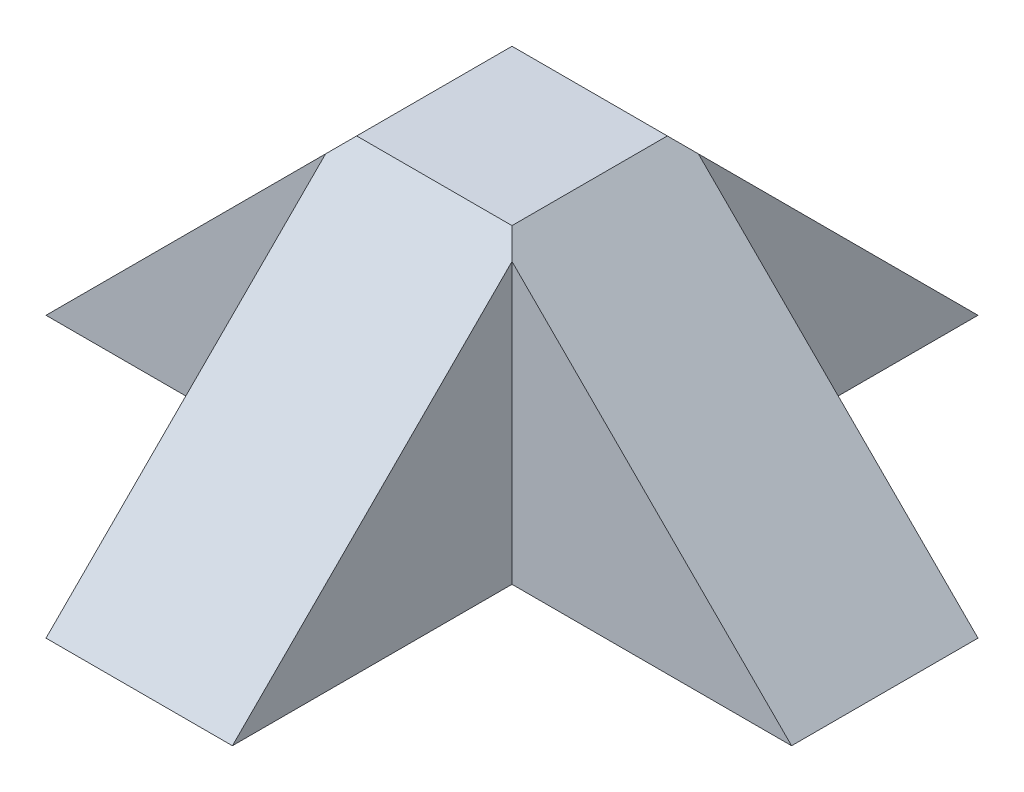
ISO-10303-21;
HEADER;
FILE_DESCRIPTION(('STEP AP214'),'2;1');
FILE_NAME('part.step','',(''),(''),'','','');
FILE_SCHEMA(('AUTOMOTIVE_DESIGN { 1 0 10303 214 1 1 1 1 }'));
ENDSEC;
DATA;
#1=APPLICATION_CONTEXT('core data for automotive mechanical design processes');
#2=APPLICATION_PROTOCOL_DEFINITION('international standard','automotive_design',2000,#1);
#3=PRODUCT_CONTEXT('',#1,'mechanical');
#4=PRODUCT('Part','Part','',(#3));
#5=PRODUCT_RELATED_PRODUCT_CATEGORY('part','',(#4));
#6=PRODUCT_DEFINITION_FORMATION('','',#4);
#7=PRODUCT_DEFINITION_CONTEXT('part definition',#1,'design');
#8=PRODUCT_DEFINITION('design','',#6,#7);
#9=PRODUCT_DEFINITION_SHAPE('','',#8);
#10=(LENGTH_UNIT() NAMED_UNIT(*) SI_UNIT(.MILLI.,.METRE.));
#11=(NAMED_UNIT(*) PLANE_ANGLE_UNIT() SI_UNIT($,.RADIAN.));
#12=(NAMED_UNIT(*) SI_UNIT($,.STERADIAN.) SOLID_ANGLE_UNIT());
#13=UNCERTAINTY_MEASURE_WITH_UNIT(LENGTH_MEASURE(1.E-05),#10,'distance_accuracy_value','');
#14=(GEOMETRIC_REPRESENTATION_CONTEXT(3) GLOBAL_UNCERTAINTY_ASSIGNED_CONTEXT((#13)) GLOBAL_UNIT_ASSIGNED_CONTEXT((#10,
#11,#12)) REPRESENTATION_CONTEXT('',''));
#15=CARTESIAN_POINT('',(0.,0.,0.));
#16=DIRECTION('',(0.,0.,1.));
#17=DIRECTION('',(1.,0.,0.));
#18=AXIS2_PLACEMENT_3D('',#15,#16,#17);
#19=CARTESIAN_POINT('',(10.2999999999994,-4.15000000000118,19.5555136271292));
#20=DIRECTION('',(0.,1.,0.));
#21=DIRECTION('',(0.,0.,1.));
#22=AXIS2_PLACEMENT_3D('',#19,#20,#21);
#23=PLANE('',#22);
#24=DIRECTION('',(0.,0.,1.));
#25=VECTOR('',#24,1.);
#26=CARTESIAN_POINT('',(10.550000000001,-4.15000000000118,19.5555136271292));
#27=LINE('',#26,#25);
#28=CARTESIAN_POINT('',(10.550000000001,-4.15000000000054,19.3055136271296));
#29=VERTEX_POINT('',#28);
#30=CARTESIAN_POINT('',(10.550000000001,-4.15000000000118,19.8055136271308));
#31=VERTEX_POINT('',#30);
#32=EDGE_CURVE('E147',#29,#31,#27,.T.);
#33=ORIENTED_EDGE('',*,*,#32,.F.);
#34=DIRECTION('',(1.,0.,0.));
#35=VECTOR('',#34,1.);
#36=CARTESIAN_POINT('',(10.2999999999994,-4.14999999999991,19.3055136271289));
#37=LINE('',#36,#35);
#38=CARTESIAN_POINT('',(10.0500000000001,-4.15000000000023,19.3055136271296));
#39=VERTEX_POINT('',#38);
#40=EDGE_CURVE('E21',#39,#29,#37,.T.);
#41=ORIENTED_EDGE('',*,*,#40,.F.);
#42=DIRECTION('',(0.,0.,1.));
#43=VECTOR('',#42,1.);
#44=CARTESIAN_POINT('',(10.0499999999992,-4.14999999999991,19.5555136271292));
#45=LINE('',#44,#43);
#46=CARTESIAN_POINT('',(10.0500000000001,-4.15000000000086,19.8055136271308));
#47=VERTEX_POINT('',#46);
#48=EDGE_CURVE('E121',#39,#47,#45,.T.);
#49=ORIENTED_EDGE('',*,*,#48,.T.);
#50=DIRECTION('',(1.,0.,0.));
#51=VECTOR('',#50,1.);
#52=CARTESIAN_POINT('',(10.2999999999994,-4.15000000000118,19.8055136271308));
#53=LINE('',#52,#51);
#54=EDGE_CURVE('E133',#31,#47,#53,.F.);
#55=ORIENTED_EDGE('',*,*,#54,.F.);
#56=EDGE_LOOP('',(#33,#41,#49,#55));
#57=FACE_BOUND('',#56,.T.);
#58=ADVANCED_FACE('F18',(#57),#23,.T.);
#59=CARTESIAN_POINT('',(10.2999999999994,-4.62499999999928,18.8305136271296));
#60=DIRECTION('',(0.,0.707106781186548,-0.707106781186548));
#61=DIRECTION('',(0.,0.707106781186548,0.707106781186548));
#62=AXIS2_PLACEMENT_3D('',#59,#60,#61);
#63=PLANE('',#62);
#64=DIRECTION('',(1.,0.,0.));
#65=VECTOR('',#64,1.);
#66=CARTESIAN_POINT('',(10.2999999999994,-5.09999999999992,18.3555136271289));
#67=LINE('',#66,#65);
#68=CARTESIAN_POINT('',(10.6000000000008,-5.09999999999992,18.3555136271289));
#69=VERTEX_POINT('',#68);
#70=CARTESIAN_POINT('',(10.0000000000006,-5.09999999999992,18.3555136271289));
#71=VERTEX_POINT('',#70);
#72=EDGE_CURVE('E103',#69,#71,#67,.F.);
#73=ORIENTED_EDGE('',*,*,#72,.T.);
#74=DIRECTION('',(0.,0.70710678118555,0.707106781187545));
#75=VECTOR('',#74,1.);
#76=CARTESIAN_POINT('',(10.0000000000006,-5.09999999999992,18.3555136271289));
#77=LINE('',#76,#75);
#78=CARTESIAN_POINT('',(10.0000000000005,-4.20000000000066,19.2555136271303));
#79=VERTEX_POINT('',#78);
#80=EDGE_CURVE('E97',#71,#79,#77,.T.);
#81=ORIENTED_EDGE('',*,*,#80,.T.);
#82=DIRECTION('',(0.577350269189626,0.577350269189626,0.577350269189626));
#83=VECTOR('',#82,1.);
#84=CARTESIAN_POINT('',(9.99999999999937,-4.19999999999971,19.2555136271304));
#85=LINE('',#84,#83);
#86=EDGE_CURVE('E101',#79,#39,#85,.T.);
#87=ORIENTED_EDGE('',*,*,#86,.T.);
#88=ORIENTED_EDGE('',*,*,#40,.T.);
#89=DIRECTION('',(-0.577350269189636,0.577350269189626,0.577350269189616));
#90=VECTOR('',#89,1.);
#91=CARTESIAN_POINT('',(10.6000000000008,-4.20000000000098,19.2555136271304));
#92=LINE('',#91,#90);
#93=CARTESIAN_POINT('',(10.6000000000008,-4.20000000000082,19.2555136271303));
#94=VERTEX_POINT('',#93);
#95=EDGE_CURVE('E144',#94,#29,#92,.T.);
#96=ORIENTED_EDGE('',*,*,#95,.F.);
#97=DIRECTION('',(0.,0.70710678118555,0.707106781187545));
#98=VECTOR('',#97,1.);
#99=CARTESIAN_POINT('',(10.6000000000008,-5.09999999999992,18.3555136271289));
#100=LINE('',#99,#98);
#101=EDGE_CURVE('E158',#69,#94,#100,.T.);
#102=ORIENTED_EDGE('',*,*,#101,.F.);
#103=EDGE_LOOP('',(#73,#81,#87,#88,#96,#102));
#104=FACE_BOUND('',#103,.T.);
#105=ADVANCED_FACE('F99',(#104),#63,.T.);
#106=CARTESIAN_POINT('',(10.0000000000006,-4.64999999999918,18.8055136271297));
#107=DIRECTION('',(1.,0.,0.));
#108=DIRECTION('',(0.,0.,-1.));
#109=AXIS2_PLACEMENT_3D('',#106,#107,#108);
#110=PLANE('',#109);
#111=DIRECTION('',(0.,1.,0.));
#112=VECTOR('',#111,1.);
#113=CARTESIAN_POINT('',(10.0000000000006,-4.64999999999918,19.2555136271304));
#114=LINE('',#113,#112);
#115=CARTESIAN_POINT('',(10.0000000000006,-5.09999999999992,19.2555136271304));
#116=VERTEX_POINT('',#115);
#117=EDGE_CURVE('E107',#116,#79,#114,.T.);
#118=ORIENTED_EDGE('',*,*,#117,.T.);
#119=ORIENTED_EDGE('',*,*,#80,.F.);
#120=DIRECTION('',(0.,0.,1.));
#121=VECTOR('',#120,1.);
#122=CARTESIAN_POINT('',(10.0000000000006,-5.09999999999992,19.5555136271292));
#123=LINE('',#122,#121);
#124=EDGE_CURVE('E109',#71,#116,#123,.T.);
#125=ORIENTED_EDGE('',*,*,#124,.T.);
#126=EDGE_LOOP('',(#118,#119,#125));
#127=FACE_BOUND('',#126,.T.);
#128=ADVANCED_FACE('F108',(#127),#110,.F.);
#129=CARTESIAN_POINT('',(9.5499999999999,-4.64999999999918,19.2555136271304));
#130=DIRECTION('',(0.,0.,1.));
#131=DIRECTION('',(1.,0.,0.));
#132=AXIS2_PLACEMENT_3D('',#129,#130,#131);
#133=PLANE('',#132);
#134=DIRECTION('',(1.,0.,0.));
#135=VECTOR('',#134,1.);
#136=CARTESIAN_POINT('',(10.2999999999994,-5.09999999999992,19.2555136271304));
#137=LINE('',#136,#135);
#138=CARTESIAN_POINT('',(9.09999999999916,-5.09999999999992,19.2555136271304));
#139=VERTEX_POINT('',#138);
#140=EDGE_CURVE('E124',#116,#139,#137,.F.);
#141=ORIENTED_EDGE('',*,*,#140,.T.);
#142=DIRECTION('',(0.707106781186548,0.707106781186548,0.));
#143=VECTOR('',#142,1.);
#144=CARTESIAN_POINT('',(9.5749999999998,-4.62499999999928,19.2555136271304));
#145=LINE('',#144,#143);
#146=EDGE_CURVE('E114',#139,#79,#145,.T.);
#147=ORIENTED_EDGE('',*,*,#146,.T.);
#148=ORIENTED_EDGE('',*,*,#117,.F.);
#149=EDGE_LOOP('',(#141,#147,#148));
#150=FACE_BOUND('',#149,.T.);
#151=ADVANCED_FACE('F123',(#150),#133,.F.);
#152=CARTESIAN_POINT('',(9.5749999999998,-4.62499999999928,19.5555136271292));
#153=DIRECTION('',(0.707106781186548,-0.707106781186548,0.));
#154=DIRECTION('',(0.707106781186548,0.707106781186548,0.));
#155=AXIS2_PLACEMENT_3D('',#152,#153,#154);
#156=PLANE('',#155);
#157=ORIENTED_EDGE('',*,*,#48,.F.);
#158=ORIENTED_EDGE('',*,*,#86,.F.);
#159=ORIENTED_EDGE('',*,*,#146,.F.);
#160=DIRECTION('',(0.,0.,1.));
#161=VECTOR('',#160,1.);
#162=CARTESIAN_POINT('',(9.09999999999916,-5.09999999999992,19.5555136271292));
#163=LINE('',#162,#161);
#164=CARTESIAN_POINT('',(9.09999999999916,-5.09999999999992,19.8555136271306));
#165=VERTEX_POINT('',#164);
#166=EDGE_CURVE('E163',#139,#165,#163,.T.);
#167=ORIENTED_EDGE('',*,*,#166,.T.);
#168=DIRECTION('',(-0.707106781187545,-0.70710678118555,0.));
#169=VECTOR('',#168,1.);
#170=CARTESIAN_POINT('',(10.0000000000006,-4.20000000000098,19.8555136271306));
#171=LINE('',#170,#169);
#172=CARTESIAN_POINT('',(10.0000000000003,-4.20000000000066,19.8555136271306));
#173=VERTEX_POINT('',#172);
#174=EDGE_CURVE('E128',#173,#165,#171,.T.);
#175=ORIENTED_EDGE('',*,*,#174,.F.);
#176=DIRECTION('',(-0.577350269189602,-0.577350269189633,0.577350269189642));
#177=VECTOR('',#176,1.);
#178=CARTESIAN_POINT('',(10.0500000000004,-4.15000000000118,19.8055136271308));
#179=LINE('',#178,#177);
#180=EDGE_CURVE('E135',#47,#173,#179,.T.);
#181=ORIENTED_EDGE('',*,*,#180,.F.);
#182=EDGE_LOOP('',(#157,#158,#159,#167,#175,#181));
#183=FACE_BOUND('',#182,.T.);
#184=ADVANCED_FACE('F117',(#183),#156,.F.);
#185=CARTESIAN_POINT('',(9.5499999999999,-4.64999999999918,19.8555136271306));
#186=DIRECTION('',(0.,0.,1.));
#187=DIRECTION('',(1.,0.,0.));
#188=AXIS2_PLACEMENT_3D('',#185,#186,#187);
#189=PLANE('',#188);
#190=DIRECTION('',(0.,1.,0.));
#191=VECTOR('',#190,1.);
#192=CARTESIAN_POINT('',(10.0000000000006,-4.64999999999918,19.8555136271306));
#193=LINE('',#192,#191);
#194=CARTESIAN_POINT('',(10.0000000000006,-5.09999999999992,19.8555136271306));
#195=VERTEX_POINT('',#194);
#196=EDGE_CURVE('E130',#195,#173,#193,.T.);
#197=ORIENTED_EDGE('',*,*,#196,.T.);
#198=ORIENTED_EDGE('',*,*,#174,.T.);
#199=DIRECTION('',(1.,0.,0.));
#200=VECTOR('',#199,1.);
#201=CARTESIAN_POINT('',(10.2999999999994,-5.09999999999992,19.8555136271306));
#202=LINE('',#201,#200);
#203=EDGE_CURVE('E165',#165,#195,#202,.T.);
#204=ORIENTED_EDGE('',*,*,#203,.T.);
#205=EDGE_LOOP('',(#197,#198,#204));
#206=FACE_BOUND('',#205,.T.);
#207=ADVANCED_FACE('F210',(#206),#189,.T.);
#208=CARTESIAN_POINT('',(10.0000000000006,-4.64999999999918,20.3055136271288));
#209=DIRECTION('',(1.,0.,0.));
#210=DIRECTION('',(0.,0.,-1.));
#211=AXIS2_PLACEMENT_3D('',#208,#209,#210);
#212=PLANE('',#211);
#213=DIRECTION('',(0.,0.,1.));
#214=VECTOR('',#213,1.);
#215=CARTESIAN_POINT('',(10.0000000000006,-5.09999999999992,19.5555136271292));
#216=LINE('',#215,#214);
#217=CARTESIAN_POINT('',(10.0000000000006,-5.09999999999992,20.7555136271295));
#218=VERTEX_POINT('',#217);
#219=EDGE_CURVE('E168',#195,#218,#216,.T.);
#220=ORIENTED_EDGE('',*,*,#219,.T.);
#221=DIRECTION('',(0.,-0.707106781186548,0.707106781186548));
#222=VECTOR('',#221,1.);
#223=CARTESIAN_POINT('',(10.0000000000006,-4.62499999999928,20.2805136271289));
#224=LINE('',#223,#222);
#225=EDGE_CURVE('E138',#173,#218,#224,.T.);
#226=ORIENTED_EDGE('',*,*,#225,.F.);
#227=ORIENTED_EDGE('',*,*,#196,.F.);
#228=EDGE_LOOP('',(#220,#226,#227));
#229=FACE_BOUND('',#228,.T.);
#230=ADVANCED_FACE('F208',(#229),#212,.F.);
#231=CARTESIAN_POINT('',(10.2999999999994,-4.62499999999928,20.2805136271289));
#232=DIRECTION('',(0.,0.707106781186548,0.707106781186548));
#233=DIRECTION('',(0.,-0.707106781186548,0.707106781186548));
#234=AXIS2_PLACEMENT_3D('',#231,#232,#233);
#235=PLANE('',#234);
#236=DIRECTION('',(1.,0.,0.));
#237=VECTOR('',#236,1.);
#238=CARTESIAN_POINT('',(10.2999999999994,-5.09999999999992,20.7555136271295));
#239=LINE('',#238,#237);
#240=CARTESIAN_POINT('',(10.6000000000008,-5.09999999999992,20.7555136271295));
#241=VERTEX_POINT('',#240);
#242=EDGE_CURVE('E171',#218,#241,#239,.T.);
#243=ORIENTED_EDGE('',*,*,#242,.T.);
#244=DIRECTION('',(0.,-0.707106781186549,0.707106781186546));
#245=VECTOR('',#244,1.);
#246=CARTESIAN_POINT('',(10.6000000000008,-4.20000000000098,19.8555136271306));
#247=LINE('',#246,#245);
#248=CARTESIAN_POINT('',(10.6000000000008,-4.20000000000098,19.8555136271306));
#249=VERTEX_POINT('',#248);
#250=EDGE_CURVE('E140',#249,#241,#247,.T.);
#251=ORIENTED_EDGE('',*,*,#250,.F.);
#252=DIRECTION('',(0.577350269189623,-0.577350269189613,0.577350269189642));
#253=VECTOR('',#252,1.);
#254=CARTESIAN_POINT('',(10.550000000001,-4.15000000000118,19.8055136271308));
#255=LINE('',#254,#253);
#256=EDGE_CURVE('E149',#31,#249,#255,.T.);
#257=ORIENTED_EDGE('',*,*,#256,.F.);
#258=ORIENTED_EDGE('',*,*,#54,.T.);
#259=ORIENTED_EDGE('',*,*,#180,.T.);
#260=ORIENTED_EDGE('',*,*,#225,.T.);
#261=EDGE_LOOP('',(#243,#251,#257,#258,#259,#260));
#262=FACE_BOUND('',#261,.T.);
#263=ADVANCED_FACE('F203',(#262),#235,.T.);
#264=CARTESIAN_POINT('',(10.6000000000008,-4.64999999999918,20.3055136271288));
#265=DIRECTION('',(1.,0.,0.));
#266=DIRECTION('',(0.,0.,-1.));
#267=AXIS2_PLACEMENT_3D('',#264,#265,#266);
#268=PLANE('',#267);
#269=DIRECTION('',(0.,1.,0.));
#270=VECTOR('',#269,1.);
#271=CARTESIAN_POINT('',(10.6000000000008,-4.64999999999918,19.8555136271306));
#272=LINE('',#271,#270);
#273=CARTESIAN_POINT('',(10.6000000000008,-5.09999999999992,19.8555136271306));
#274=VERTEX_POINT('',#273);
#275=EDGE_CURVE('E142',#249,#274,#272,.F.);
#276=ORIENTED_EDGE('',*,*,#275,.F.);
#277=ORIENTED_EDGE('',*,*,#250,.T.);
#278=DIRECTION('',(0.,0.,1.));
#279=VECTOR('',#278,1.);
#280=CARTESIAN_POINT('',(10.6000000000008,-5.09999999999992,19.5555136271292));
#281=LINE('',#280,#279);
#282=EDGE_CURVE('E174',#241,#274,#281,.F.);
#283=ORIENTED_EDGE('',*,*,#282,.T.);
#284=EDGE_LOOP('',(#276,#277,#283));
#285=FACE_BOUND('',#284,.T.);
#286=ADVANCED_FACE('F201',(#285),#268,.T.);
#287=CARTESIAN_POINT('',(11.049999999999,-4.64999999999918,19.8555136271306));
#288=DIRECTION('',(0.,0.,1.));
#289=DIRECTION('',(1.,0.,0.));
#290=AXIS2_PLACEMENT_3D('',#287,#288,#289);
#291=PLANE('',#290);
#292=DIRECTION('',(1.,0.,0.));
#293=VECTOR('',#292,1.);
#294=CARTESIAN_POINT('',(10.2999999999994,-5.09999999999992,19.8555136271306));
#295=LINE('',#294,#293);
#296=CARTESIAN_POINT('',(11.4999999999997,-5.09999999999992,19.8555136271306));
#297=VERTEX_POINT('',#296);
#298=EDGE_CURVE('E177',#274,#297,#295,.T.);
#299=ORIENTED_EDGE('',*,*,#298,.T.);
#300=DIRECTION('',(-0.707106781186548,0.707106781186548,0.));
#301=VECTOR('',#300,1.);
#302=CARTESIAN_POINT('',(11.0249999999991,-4.62499999999928,19.8555136271306));
#303=LINE('',#302,#301);
#304=EDGE_CURVE('E152',#249,#297,#303,.F.);
#305=ORIENTED_EDGE('',*,*,#304,.F.);
#306=ORIENTED_EDGE('',*,*,#275,.T.);
#307=EDGE_LOOP('',(#299,#305,#306));
#308=FACE_BOUND('',#307,.T.);
#309=ADVANCED_FACE('F197',(#308),#291,.T.);
#310=CARTESIAN_POINT('',(11.0249999999991,-4.62499999999928,19.5555136271292));
#311=DIRECTION('',(0.707106781186548,0.707106781186548,0.));
#312=DIRECTION('',(-0.707106781186548,0.707106781186548,0.));
#313=AXIS2_PLACEMENT_3D('',#310,#311,#312);
#314=PLANE('',#313);
#315=DIRECTION('',(0.,0.,1.));
#316=VECTOR('',#315,1.);
#317=CARTESIAN_POINT('',(11.4999999999997,-5.09999999999992,19.5555136271292));
#318=LINE('',#317,#316);
#319=CARTESIAN_POINT('',(11.4999999999997,-5.09999999999992,19.2555136271304));
#320=VERTEX_POINT('',#319);
#321=EDGE_CURVE('E180',#297,#320,#318,.F.);
#322=ORIENTED_EDGE('',*,*,#321,.T.);
#323=DIRECTION('',(-0.707106781186547,0.707106781186547,0.));
#324=VECTOR('',#323,1.);
#325=CARTESIAN_POINT('',(11.4999999999997,-5.09999999999992,19.2555136271304));
#326=LINE('',#325,#324);
#327=EDGE_CURVE('E154',#320,#94,#326,.T.);
#328=ORIENTED_EDGE('',*,*,#327,.T.);
#329=ORIENTED_EDGE('',*,*,#95,.T.);
#330=ORIENTED_EDGE('',*,*,#32,.T.);
#331=ORIENTED_EDGE('',*,*,#256,.T.);
#332=ORIENTED_EDGE('',*,*,#304,.T.);
#333=EDGE_LOOP('',(#322,#328,#329,#330,#331,#332));
#334=FACE_BOUND('',#333,.T.);
#335=ADVANCED_FACE('F192',(#334),#314,.T.);
#336=CARTESIAN_POINT('',(11.049999999999,-4.64999999999918,19.2555136271304));
#337=DIRECTION('',(0.,0.,1.));
#338=DIRECTION('',(1.,0.,0.));
#339=AXIS2_PLACEMENT_3D('',#336,#337,#338);
#340=PLANE('',#339);
#341=DIRECTION('',(0.,1.,0.));
#342=VECTOR('',#341,1.);
#343=CARTESIAN_POINT('',(10.6000000000008,-4.64999999999918,19.2555136271304));
#344=LINE('',#343,#342);
#345=CARTESIAN_POINT('',(10.6000000000008,-5.09999999999992,19.2555136271304));
#346=VERTEX_POINT('',#345);
#347=EDGE_CURVE('E35',#94,#346,#344,.F.);
#348=ORIENTED_EDGE('',*,*,#347,.F.);
#349=ORIENTED_EDGE('',*,*,#327,.F.);
#350=DIRECTION('',(1.,0.,0.));
#351=VECTOR('',#350,1.);
#352=CARTESIAN_POINT('',(10.2999999999994,-5.09999999999992,19.2555136271304));
#353=LINE('',#352,#351);
#354=EDGE_CURVE('E27',#320,#346,#353,.F.);
#355=ORIENTED_EDGE('',*,*,#354,.T.);
#356=EDGE_LOOP('',(#348,#349,#355));
#357=FACE_BOUND('',#356,.T.);
#358=ADVANCED_FACE('F186',(#357),#340,.F.);
#359=CARTESIAN_POINT('',(10.6000000000008,-4.64999999999918,18.8055136271297));
#360=DIRECTION('',(1.,0.,0.));
#361=DIRECTION('',(0.,0.,-1.));
#362=AXIS2_PLACEMENT_3D('',#359,#360,#361);
#363=PLANE('',#362);
#364=DIRECTION('',(0.,0.,1.));
#365=VECTOR('',#364,1.);
#366=CARTESIAN_POINT('',(10.6000000000008,-5.09999999999992,19.5555136271292));
#367=LINE('',#366,#365);
#368=EDGE_CURVE('E11',#346,#69,#367,.F.);
#369=ORIENTED_EDGE('',*,*,#368,.T.);
#370=ORIENTED_EDGE('',*,*,#101,.T.);
#371=ORIENTED_EDGE('',*,*,#347,.T.);
#372=EDGE_LOOP('',(#369,#370,#371));
#373=FACE_BOUND('',#372,.T.);
#374=ADVANCED_FACE('F218',(#373),#363,.T.);
#375=CARTESIAN_POINT('',(10.2999999999994,-5.09999999999992,19.5555136271292));
#376=DIRECTION('',(0.,1.,0.));
#377=DIRECTION('',(0.,0.,1.));
#378=AXIS2_PLACEMENT_3D('',#375,#376,#377);
#379=PLANE('',#378);
#380=ORIENTED_EDGE('',*,*,#354,.F.);
#381=ORIENTED_EDGE('',*,*,#321,.F.);
#382=ORIENTED_EDGE('',*,*,#298,.F.);
#383=ORIENTED_EDGE('',*,*,#282,.F.);
#384=ORIENTED_EDGE('',*,*,#242,.F.);
#385=ORIENTED_EDGE('',*,*,#219,.F.);
#386=ORIENTED_EDGE('',*,*,#203,.F.);
#387=ORIENTED_EDGE('',*,*,#166,.F.);
#388=ORIENTED_EDGE('',*,*,#140,.F.);
#389=ORIENTED_EDGE('',*,*,#124,.F.);
#390=ORIENTED_EDGE('',*,*,#72,.F.);
#391=ORIENTED_EDGE('',*,*,#368,.F.);
#392=EDGE_LOOP('',(#380,#381,#382,#383,#384,#385,#386,#387,#388,#389,#390,#391));
#393=FACE_BOUND('',#392,.T.);
#394=ADVANCED_FACE('F189',(#393),#379,.F.);
#395=CLOSED_SHELL('',(#58,#105,#128,#151,#184,#207,#230,#263,#286,#309,#335,#358,#374,#394));
#396=MANIFOLD_SOLID_BREP('B1',#395);
#397=ADVANCED_BREP_SHAPE_REPRESENTATION('',(#18,#396),#14);
#398=SHAPE_DEFINITION_REPRESENTATION(#9,#397);
ENDSEC;
END-ISO-10303-21;
